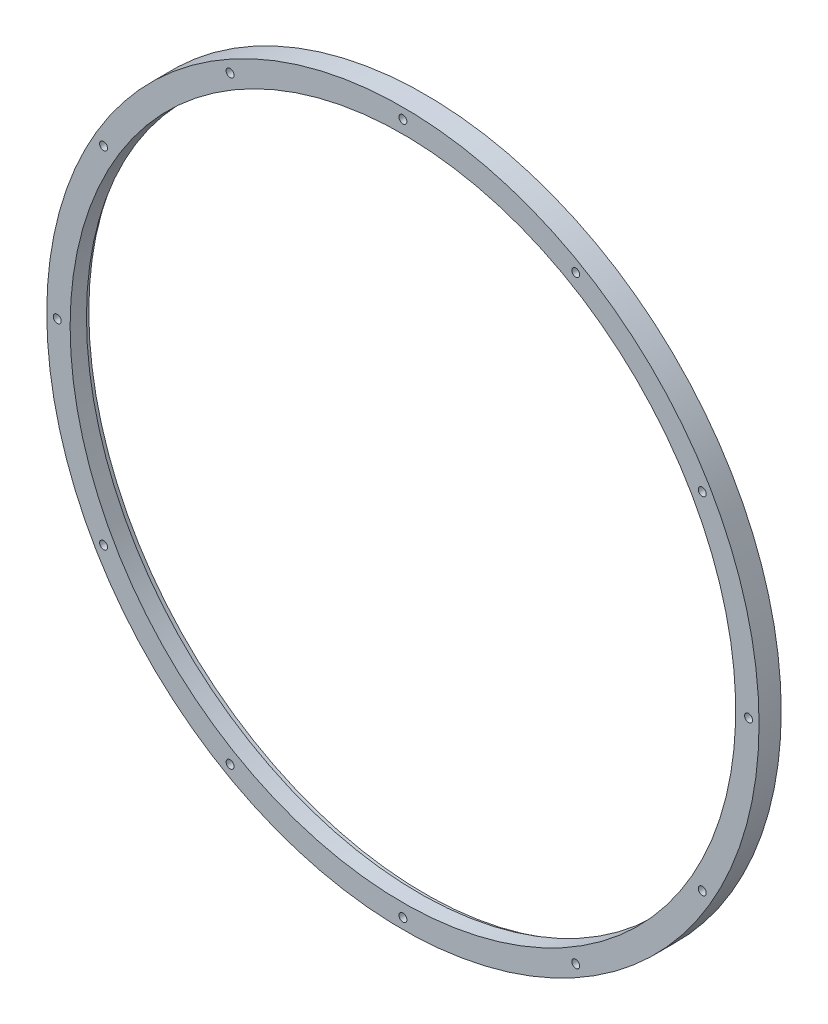
ISO-10303-21;
HEADER;
FILE_DESCRIPTION(('STEP AP214'),'2;1');
FILE_NAME('part.step','',(''),(''),'','','');
FILE_SCHEMA(('AUTOMOTIVE_DESIGN { 1 0 10303 214 1 1 1 1 }'));
ENDSEC;
DATA;
#1=APPLICATION_CONTEXT('core data for automotive mechanical design processes');
#2=APPLICATION_PROTOCOL_DEFINITION('international standard','automotive_design',2000,#1);
#3=PRODUCT_CONTEXT('',#1,'mechanical');
#4=PRODUCT('Part','Part','',(#3));
#5=PRODUCT_RELATED_PRODUCT_CATEGORY('part','',(#4));
#6=PRODUCT_DEFINITION_FORMATION('','',#4);
#7=PRODUCT_DEFINITION_CONTEXT('part definition',#1,'design');
#8=PRODUCT_DEFINITION('design','',#6,#7);
#9=PRODUCT_DEFINITION_SHAPE('','',#8);
#10=(LENGTH_UNIT() NAMED_UNIT(*) SI_UNIT(.MILLI.,.METRE.));
#11=(NAMED_UNIT(*) PLANE_ANGLE_UNIT() SI_UNIT($,.RADIAN.));
#12=(NAMED_UNIT(*) SI_UNIT($,.STERADIAN.) SOLID_ANGLE_UNIT());
#13=UNCERTAINTY_MEASURE_WITH_UNIT(LENGTH_MEASURE(1.E-05),#10,'distance_accuracy_value','');
#14=(GEOMETRIC_REPRESENTATION_CONTEXT(3) GLOBAL_UNCERTAINTY_ASSIGNED_CONTEXT((#13)) GLOBAL_UNIT_ASSIGNED_CONTEXT((#10,
#11,#12)) REPRESENTATION_CONTEXT('',''));
#15=CARTESIAN_POINT('',(0.,0.,0.));
#16=DIRECTION('',(0.,0.,1.));
#17=DIRECTION('',(1.,0.,0.));
#18=AXIS2_PLACEMENT_3D('',#15,#16,#17);
#19=CARTESIAN_POINT('',(256.3435195202,-148.,-2.945));
#20=DIRECTION('',(0.,0.,1.));
#21=DIRECTION('',(-0.866025403784429,0.500000000000017,0.));
#22=AXIS2_PLACEMENT_3D('',#19,#20,#21);
#23=CYLINDRICAL_SURFACE('',#22,3.4);
#24=CARTESIAN_POINT('',(256.3435195202,-148.,0.));
#25=DIRECTION('',(0.,0.,1.));
#26=DIRECTION('',(-0.866025403784454,0.499999999999973,0.));
#27=AXIS2_PLACEMENT_3D('',#24,#25,#26);
#28=CIRCLE('',#27,3.4);
#29=CARTESIAN_POINT('',(259.2880058931,-149.7,0.));
#30=VERTEX_POINT('',#29);
#31=EDGE_CURVE('E184',#30,#30,#28,.T.);
#32=ORIENTED_EDGE('',*,*,#31,.F.);
#33=DIRECTION('',(0.,0.,1.));
#34=VECTOR('',#33,1.);
#35=CARTESIAN_POINT('',(259.288005893067,-149.7,-2.945));
#36=LINE('',#35,#34);
#37=CARTESIAN_POINT('',(259.2880058931,-149.7,19.));
#38=VERTEX_POINT('',#37);
#39=EDGE_CURVE('E11',#30,#38,#36,.T.);
#40=ORIENTED_EDGE('',*,*,#39,.T.);
#41=CARTESIAN_POINT('',(256.3435195202,-148.,19.));
#42=DIRECTION('',(0.,0.,1.));
#43=DIRECTION('',(-0.866025403784454,0.499999999999973,0.));
#44=AXIS2_PLACEMENT_3D('',#41,#42,#43);
#45=CIRCLE('',#44,3.4);
#46=EDGE_CURVE('E285',#38,#38,#45,.T.);
#47=ORIENTED_EDGE('',*,*,#46,.T.);
#48=ORIENTED_EDGE('',*,*,#39,.F.);
#49=EDGE_LOOP('',(#32,#40,#47,#48));
#50=FACE_BOUND('',#49,.T.);
#51=ADVANCED_FACE('F17',(#50),#23,.F.);
#52=CARTESIAN_POINT('',(148.,-256.3435195202,-2.945));
#53=DIRECTION('',(0.,0.,1.));
#54=DIRECTION('',(-0.500000000000017,0.866025403784429,0.));
#55=AXIS2_PLACEMENT_3D('',#52,#53,#54);
#56=CYLINDRICAL_SURFACE('',#55,3.4);
#57=CARTESIAN_POINT('',(148.,-256.3435195202,0.));
#58=DIRECTION('',(0.,0.,1.));
#59=DIRECTION('',(-0.500000000000017,0.866025403784429,0.));
#60=AXIS2_PLACEMENT_3D('',#57,#58,#59);
#61=CIRCLE('',#60,3.4);
#62=CARTESIAN_POINT('',(149.7,-259.2880058931,0.));
#63=VERTEX_POINT('',#62);
#64=EDGE_CURVE('E175',#63,#63,#61,.T.);
#65=ORIENTED_EDGE('',*,*,#64,.F.);
#66=DIRECTION('',(0.,0.,1.));
#67=VECTOR('',#66,1.);
#68=CARTESIAN_POINT('',(149.7,-259.288005893067,-2.945));
#69=LINE('',#68,#67);
#70=CARTESIAN_POINT('',(149.7,-259.2880058931,19.));
#71=VERTEX_POINT('',#70);
#72=EDGE_CURVE('E27',#63,#71,#69,.T.);
#73=ORIENTED_EDGE('',*,*,#72,.T.);
#74=CARTESIAN_POINT('',(148.,-256.3435195202,19.));
#75=DIRECTION('',(0.,0.,1.));
#76=DIRECTION('',(-0.500000000000017,0.866025403784429,0.));
#77=AXIS2_PLACEMENT_3D('',#74,#75,#76);
#78=CIRCLE('',#77,3.4);
#79=EDGE_CURVE('E177',#71,#71,#78,.T.);
#80=ORIENTED_EDGE('',*,*,#79,.T.);
#81=ORIENTED_EDGE('',*,*,#72,.F.);
#82=EDGE_LOOP('',(#65,#73,#80,#81));
#83=FACE_BOUND('',#82,.T.);
#84=ADVANCED_FACE('F174',(#83),#56,.F.);
#85=CARTESIAN_POINT('',(0.,-296.,-2.945));
#86=DIRECTION('',(0.,0.,1.));
#87=DIRECTION('',(0.,1.,0.));
#88=AXIS2_PLACEMENT_3D('',#85,#86,#87);
#89=CYLINDRICAL_SURFACE('',#88,3.4);
#90=CARTESIAN_POINT('',(0.,-296.,0.));
#91=DIRECTION('',(0.,0.,1.));
#92=DIRECTION('',(0.,1.,0.));
#93=AXIS2_PLACEMENT_3D('',#90,#91,#92);
#94=CIRCLE('',#93,3.4);
#95=CARTESIAN_POINT('',(0.,-299.4,0.));
#96=VERTEX_POINT('',#95);
#97=EDGE_CURVE('E185',#96,#96,#94,.T.);
#98=ORIENTED_EDGE('',*,*,#97,.F.);
#99=DIRECTION('',(0.,0.,1.));
#100=VECTOR('',#99,1.);
#101=CARTESIAN_POINT('',(0.,-299.4,-2.945));
#102=LINE('',#101,#100);
#103=CARTESIAN_POINT('',(0.,-299.4,19.));
#104=VERTEX_POINT('',#103);
#105=EDGE_CURVE('E179',#96,#104,#102,.T.);
#106=ORIENTED_EDGE('',*,*,#105,.T.);
#107=CARTESIAN_POINT('',(0.,-296.,19.));
#108=DIRECTION('',(0.,0.,1.));
#109=DIRECTION('',(0.,1.,0.));
#110=AXIS2_PLACEMENT_3D('',#107,#108,#109);
#111=CIRCLE('',#110,3.4);
#112=EDGE_CURVE('E206',#104,#104,#111,.T.);
#113=ORIENTED_EDGE('',*,*,#112,.T.);
#114=ORIENTED_EDGE('',*,*,#105,.F.);
#115=EDGE_LOOP('',(#98,#106,#113,#114));
#116=FACE_BOUND('',#115,.T.);
#117=ADVANCED_FACE('F361',(#116),#89,.F.);
#118=CARTESIAN_POINT('',(-148.,-256.3435195202,-2.945));
#119=DIRECTION('',(0.,0.,1.));
#120=DIRECTION('',(0.500000000000017,0.866025403784429,0.));
#121=AXIS2_PLACEMENT_3D('',#118,#119,#120);
#122=CYLINDRICAL_SURFACE('',#121,3.4);
#123=CARTESIAN_POINT('',(-148.,-256.3435195202,0.));
#124=DIRECTION('',(0.,0.,1.));
#125=DIRECTION('',(0.499999999999973,0.866025403784454,0.));
#126=AXIS2_PLACEMENT_3D('',#123,#124,#125);
#127=CIRCLE('',#126,3.4);
#128=CARTESIAN_POINT('',(-149.7,-259.2880058931,0.));
#129=VERTEX_POINT('',#128);
#130=EDGE_CURVE('E196',#129,#129,#127,.T.);
#131=ORIENTED_EDGE('',*,*,#130,.F.);
#132=DIRECTION('',(0.,0.,1.));
#133=VECTOR('',#132,1.);
#134=CARTESIAN_POINT('',(-149.7,-259.288005893067,-2.945));
#135=LINE('',#134,#133);
#136=CARTESIAN_POINT('',(-149.7,-259.2880058931,19.));
#137=VERTEX_POINT('',#136);
#138=EDGE_CURVE('E257',#129,#137,#135,.T.);
#139=ORIENTED_EDGE('',*,*,#138,.T.);
#140=CARTESIAN_POINT('',(-148.,-256.3435195202,19.));
#141=DIRECTION('',(0.,0.,1.));
#142=DIRECTION('',(0.499999999999973,0.866025403784454,0.));
#143=AXIS2_PLACEMENT_3D('',#140,#141,#142);
#144=CIRCLE('',#143,3.4);
#145=EDGE_CURVE('E202',#137,#137,#144,.T.);
#146=ORIENTED_EDGE('',*,*,#145,.T.);
#147=ORIENTED_EDGE('',*,*,#138,.F.);
#148=EDGE_LOOP('',(#131,#139,#146,#147));
#149=FACE_BOUND('',#148,.T.);
#150=ADVANCED_FACE('F383',(#149),#122,.F.);
#151=CARTESIAN_POINT('',(-256.3435195202,-148.,-2.945));
#152=DIRECTION('',(0.,0.,1.));
#153=DIRECTION('',(0.866025403784429,0.500000000000017,0.));
#154=AXIS2_PLACEMENT_3D('',#151,#152,#153);
#155=CYLINDRICAL_SURFACE('',#154,3.4);
#156=CARTESIAN_POINT('',(-256.3435195202,-148.,0.));
#157=DIRECTION('',(0.,0.,1.));
#158=DIRECTION('',(0.866025403784429,0.500000000000017,0.));
#159=AXIS2_PLACEMENT_3D('',#156,#157,#158);
#160=CIRCLE('',#159,3.4);
#161=CARTESIAN_POINT('',(-259.2880058931,-149.7,0.));
#162=VERTEX_POINT('',#161);
#163=EDGE_CURVE('E267',#162,#162,#160,.T.);
#164=ORIENTED_EDGE('',*,*,#163,.F.);
#165=DIRECTION('',(0.,0.,1.));
#166=VECTOR('',#165,1.);
#167=CARTESIAN_POINT('',(-259.288005893067,-149.7,-2.945));
#168=LINE('',#167,#166);
#169=CARTESIAN_POINT('',(-259.2880058931,-149.7,19.));
#170=VERTEX_POINT('',#169);
#171=EDGE_CURVE('E220',#162,#170,#168,.T.);
#172=ORIENTED_EDGE('',*,*,#171,.T.);
#173=CARTESIAN_POINT('',(-256.3435195202,-148.,19.));
#174=DIRECTION('',(0.,0.,1.));
#175=DIRECTION('',(0.866025403784429,0.500000000000017,0.));
#176=AXIS2_PLACEMENT_3D('',#173,#174,#175);
#177=CIRCLE('',#176,3.4);
#178=EDGE_CURVE('E207',#170,#170,#177,.T.);
#179=ORIENTED_EDGE('',*,*,#178,.T.);
#180=ORIENTED_EDGE('',*,*,#171,.F.);
#181=EDGE_LOOP('',(#164,#172,#179,#180));
#182=FACE_BOUND('',#181,.T.);
#183=ADVANCED_FACE('F380',(#182),#155,.F.);
#184=CARTESIAN_POINT('',(-296.,0.,-2.945));
#185=DIRECTION('',(0.,0.,1.));
#186=DIRECTION('',(1.,0.,0.));
#187=AXIS2_PLACEMENT_3D('',#184,#185,#186);
#188=CYLINDRICAL_SURFACE('',#187,3.4);
#189=CARTESIAN_POINT('',(-296.,0.,0.));
#190=DIRECTION('',(0.,0.,1.));
#191=DIRECTION('',(1.,0.,0.));
#192=AXIS2_PLACEMENT_3D('',#189,#190,#191);
#193=CIRCLE('',#192,3.4);
#194=CARTESIAN_POINT('',(-299.4,0.,0.));
#195=VERTEX_POINT('',#194);
#196=EDGE_CURVE('E200',#195,#195,#193,.T.);
#197=ORIENTED_EDGE('',*,*,#196,.F.);
#198=DIRECTION('',(0.,0.,1.));
#199=VECTOR('',#198,1.);
#200=CARTESIAN_POINT('',(-299.4,0.,-2.945));
#201=LINE('',#200,#199);
#202=CARTESIAN_POINT('',(-299.4,0.,19.));
#203=VERTEX_POINT('',#202);
#204=EDGE_CURVE('E217',#195,#203,#201,.T.);
#205=ORIENTED_EDGE('',*,*,#204,.T.);
#206=CARTESIAN_POINT('',(-296.,0.,19.));
#207=DIRECTION('',(0.,0.,1.));
#208=DIRECTION('',(1.,0.,0.));
#209=AXIS2_PLACEMENT_3D('',#206,#207,#208);
#210=CIRCLE('',#209,3.4);
#211=EDGE_CURVE('E211',#203,#203,#210,.T.);
#212=ORIENTED_EDGE('',*,*,#211,.T.);
#213=ORIENTED_EDGE('',*,*,#204,.F.);
#214=EDGE_LOOP('',(#197,#205,#212,#213));
#215=FACE_BOUND('',#214,.T.);
#216=ADVANCED_FACE('F382',(#215),#188,.F.);
#217=CARTESIAN_POINT('',(-256.3435195202,148.,-2.945));
#218=DIRECTION('',(0.,0.,1.));
#219=DIRECTION('',(0.866025403784429,-0.500000000000017,0.));
#220=AXIS2_PLACEMENT_3D('',#217,#218,#219);
#221=CYLINDRICAL_SURFACE('',#220,3.4);
#222=CARTESIAN_POINT('',(-256.3435195202,148.,0.));
#223=DIRECTION('',(0.,0.,1.));
#224=DIRECTION('',(0.866025403784429,-0.500000000000017,0.));
#225=AXIS2_PLACEMENT_3D('',#222,#223,#224);
#226=CIRCLE('',#225,3.4);
#227=CARTESIAN_POINT('',(-259.2880058931,149.7,0.));
#228=VERTEX_POINT('',#227);
#229=EDGE_CURVE('E317',#228,#228,#226,.T.);
#230=ORIENTED_EDGE('',*,*,#229,.F.);
#231=DIRECTION('',(0.,0.,1.));
#232=VECTOR('',#231,1.);
#233=CARTESIAN_POINT('',(-259.288005893067,149.7,-2.945));
#234=LINE('',#233,#232);
#235=CARTESIAN_POINT('',(-259.2880058931,149.7,19.));
#236=VERTEX_POINT('',#235);
#237=EDGE_CURVE('E21',#228,#236,#234,.T.);
#238=ORIENTED_EDGE('',*,*,#237,.T.);
#239=CARTESIAN_POINT('',(-256.3435195202,148.,19.));
#240=DIRECTION('',(0.,0.,1.));
#241=DIRECTION('',(0.866025403784429,-0.500000000000017,0.));
#242=AXIS2_PLACEMENT_3D('',#239,#240,#241);
#243=CIRCLE('',#242,3.4);
#244=EDGE_CURVE('E212',#236,#236,#243,.T.);
#245=ORIENTED_EDGE('',*,*,#244,.T.);
#246=ORIENTED_EDGE('',*,*,#237,.F.);
#247=EDGE_LOOP('',(#230,#238,#245,#246));
#248=FACE_BOUND('',#247,.T.);
#249=ADVANCED_FACE('F390',(#248),#221,.F.);
#250=CARTESIAN_POINT('',(-148.,256.3435195202,-2.945));
#251=DIRECTION('',(0.,0.,1.));
#252=DIRECTION('',(0.500000000000017,-0.866025403784429,0.));
#253=AXIS2_PLACEMENT_3D('',#250,#251,#252);
#254=CYLINDRICAL_SURFACE('',#253,3.4);
#255=CARTESIAN_POINT('',(-148.,256.3435195202,0.));
#256=DIRECTION('',(0.,0.,1.));
#257=DIRECTION('',(0.500000000000017,-0.866025403784429,0.));
#258=AXIS2_PLACEMENT_3D('',#255,#256,#257);
#259=CIRCLE('',#258,3.4);
#260=CARTESIAN_POINT('',(-149.7,259.2880058931,0.));
#261=VERTEX_POINT('',#260);
#262=EDGE_CURVE('E266',#261,#261,#259,.T.);
#263=ORIENTED_EDGE('',*,*,#262,.F.);
#264=DIRECTION('',(0.,0.,1.));
#265=VECTOR('',#264,1.);
#266=CARTESIAN_POINT('',(-149.7,259.288005893067,-2.945));
#267=LINE('',#266,#265);
#268=CARTESIAN_POINT('',(-149.7,259.2880058931,19.));
#269=VERTEX_POINT('',#268);
#270=EDGE_CURVE('E118',#261,#269,#267,.T.);
#271=ORIENTED_EDGE('',*,*,#270,.T.);
#272=CARTESIAN_POINT('',(-148.,256.3435195202,19.));
#273=DIRECTION('',(0.,0.,1.));
#274=DIRECTION('',(0.500000000000017,-0.866025403784429,0.));
#275=AXIS2_PLACEMENT_3D('',#272,#273,#274);
#276=CIRCLE('',#275,3.4);
#277=EDGE_CURVE('E215',#269,#269,#276,.T.);
#278=ORIENTED_EDGE('',*,*,#277,.T.);
#279=ORIENTED_EDGE('',*,*,#270,.F.);
#280=EDGE_LOOP('',(#263,#271,#278,#279));
#281=FACE_BOUND('',#280,.T.);
#282=ADVANCED_FACE('F372',(#281),#254,.F.);
#283=CARTESIAN_POINT('',(0.,296.,-2.945));
#284=DIRECTION('',(0.,0.,1.));
#285=DIRECTION('',(0.,-1.,0.));
#286=AXIS2_PLACEMENT_3D('',#283,#284,#285);
#287=CYLINDRICAL_SURFACE('',#286,3.4);
#288=CARTESIAN_POINT('',(0.,296.,0.));
#289=DIRECTION('',(0.,0.,1.));
#290=DIRECTION('',(0.,-1.,0.));
#291=AXIS2_PLACEMENT_3D('',#288,#289,#290);
#292=CIRCLE('',#291,3.4);
#293=CARTESIAN_POINT('',(0.,299.4,0.));
#294=VERTEX_POINT('',#293);
#295=EDGE_CURVE('E262',#294,#294,#292,.T.);
#296=ORIENTED_EDGE('',*,*,#295,.F.);
#297=DIRECTION('',(0.,0.,1.));
#298=VECTOR('',#297,1.);
#299=CARTESIAN_POINT('',(0.,299.4,-2.945));
#300=LINE('',#299,#298);
#301=CARTESIAN_POINT('',(0.,299.4,19.));
#302=VERTEX_POINT('',#301);
#303=EDGE_CURVE('E126',#294,#302,#300,.T.);
#304=ORIENTED_EDGE('',*,*,#303,.T.);
#305=CARTESIAN_POINT('',(0.,296.,19.));
#306=DIRECTION('',(0.,0.,1.));
#307=DIRECTION('',(0.,-1.,0.));
#308=AXIS2_PLACEMENT_3D('',#305,#306,#307);
#309=CIRCLE('',#308,3.4);
#310=EDGE_CURVE('E235',#302,#302,#309,.T.);
#311=ORIENTED_EDGE('',*,*,#310,.T.);
#312=ORIENTED_EDGE('',*,*,#303,.F.);
#313=EDGE_LOOP('',(#296,#304,#311,#312));
#314=FACE_BOUND('',#313,.T.);
#315=ADVANCED_FACE('F368',(#314),#287,.F.);
#316=CARTESIAN_POINT('',(148.,256.3435195202,-2.945));
#317=DIRECTION('',(0.,0.,1.));
#318=DIRECTION('',(-0.500000000000017,-0.866025403784429,0.));
#319=AXIS2_PLACEMENT_3D('',#316,#317,#318);
#320=CYLINDRICAL_SURFACE('',#319,3.4);
#321=CARTESIAN_POINT('',(148.,256.3435195202,0.));
#322=DIRECTION('',(0.,0.,1.));
#323=DIRECTION('',(-0.500000000000017,-0.866025403784429,0.));
#324=AXIS2_PLACEMENT_3D('',#321,#322,#323);
#325=CIRCLE('',#324,3.4);
#326=CARTESIAN_POINT('',(149.7,259.2880058931,0.));
#327=VERTEX_POINT('',#326);
#328=EDGE_CURVE('E229',#327,#327,#325,.T.);
#329=ORIENTED_EDGE('',*,*,#328,.F.);
#330=DIRECTION('',(0.,0.,1.));
#331=VECTOR('',#330,1.);
#332=CARTESIAN_POINT('',(149.7,259.288005893067,-2.945));
#333=LINE('',#332,#331);
#334=CARTESIAN_POINT('',(149.7,259.2880058931,19.));
#335=VERTEX_POINT('',#334);
#336=EDGE_CURVE('E244',#327,#335,#333,.T.);
#337=ORIENTED_EDGE('',*,*,#336,.T.);
#338=CARTESIAN_POINT('',(148.,256.3435195202,19.));
#339=DIRECTION('',(0.,0.,1.));
#340=DIRECTION('',(-0.500000000000017,-0.866025403784429,0.));
#341=AXIS2_PLACEMENT_3D('',#338,#339,#340);
#342=CIRCLE('',#341,3.4);
#343=EDGE_CURVE('E231',#335,#335,#342,.T.);
#344=ORIENTED_EDGE('',*,*,#343,.T.);
#345=ORIENTED_EDGE('',*,*,#336,.F.);
#346=EDGE_LOOP('',(#329,#337,#344,#345));
#347=FACE_BOUND('',#346,.T.);
#348=ADVANCED_FACE('F371',(#347),#320,.F.);
#349=CARTESIAN_POINT('',(256.3435195202,148.,-2.945));
#350=DIRECTION('',(0.,0.,1.));
#351=DIRECTION('',(-0.866025403784429,-0.500000000000017,0.));
#352=AXIS2_PLACEMENT_3D('',#349,#350,#351);
#353=CYLINDRICAL_SURFACE('',#352,3.4);
#354=CARTESIAN_POINT('',(256.3435195202,148.,0.));
#355=DIRECTION('',(0.,0.,1.));
#356=DIRECTION('',(-0.866025403784429,-0.500000000000017,0.));
#357=AXIS2_PLACEMENT_3D('',#354,#355,#356);
#358=CIRCLE('',#357,3.4);
#359=CARTESIAN_POINT('',(259.2880058931,149.7,0.));
#360=VERTEX_POINT('',#359);
#361=EDGE_CURVE('E225',#360,#360,#358,.T.);
#362=ORIENTED_EDGE('',*,*,#361,.F.);
#363=DIRECTION('',(0.,0.,1.));
#364=VECTOR('',#363,1.);
#365=CARTESIAN_POINT('',(259.288005893067,149.7,-2.945));
#366=LINE('',#365,#364);
#367=CARTESIAN_POINT('',(259.2880058931,149.7,19.));
#368=VERTEX_POINT('',#367);
#369=EDGE_CURVE('E275',#360,#368,#366,.T.);
#370=ORIENTED_EDGE('',*,*,#369,.T.);
#371=CARTESIAN_POINT('',(256.3435195202,148.,19.));
#372=DIRECTION('',(0.,0.,1.));
#373=DIRECTION('',(-0.866025403784429,-0.500000000000017,0.));
#374=AXIS2_PLACEMENT_3D('',#371,#372,#373);
#375=CIRCLE('',#374,3.4);
#376=EDGE_CURVE('E236',#368,#368,#375,.T.);
#377=ORIENTED_EDGE('',*,*,#376,.T.);
#378=ORIENTED_EDGE('',*,*,#369,.F.);
#379=EDGE_LOOP('',(#362,#370,#377,#378));
#380=FACE_BOUND('',#379,.T.);
#381=ADVANCED_FACE('F332',(#380),#353,.F.);
#382=CARTESIAN_POINT('',(296.,0.,-2.945));
#383=DIRECTION('',(0.,0.,1.));
#384=DIRECTION('',(-1.,0.,0.));
#385=AXIS2_PLACEMENT_3D('',#382,#383,#384);
#386=CYLINDRICAL_SURFACE('',#385,3.4);
#387=CARTESIAN_POINT('',(296.,0.,0.));
#388=DIRECTION('',(0.,0.,1.));
#389=DIRECTION('',(-1.,0.,0.));
#390=AXIS2_PLACEMENT_3D('',#387,#388,#389);
#391=CIRCLE('',#390,3.4);
#392=CARTESIAN_POINT('',(299.4,0.,0.));
#393=VERTEX_POINT('',#392);
#394=EDGE_CURVE('E230',#393,#393,#391,.T.);
#395=ORIENTED_EDGE('',*,*,#394,.F.);
#396=DIRECTION('',(0.,0.,1.));
#397=VECTOR('',#396,1.);
#398=CARTESIAN_POINT('',(299.4,0.,-2.945));
#399=LINE('',#398,#397);
#400=CARTESIAN_POINT('',(299.4,0.,19.));
#401=VERTEX_POINT('',#400);
#402=EDGE_CURVE('E271',#393,#401,#399,.T.);
#403=ORIENTED_EDGE('',*,*,#402,.T.);
#404=CARTESIAN_POINT('',(296.,0.,19.));
#405=DIRECTION('',(0.,0.,1.));
#406=DIRECTION('',(-1.,0.,0.));
#407=AXIS2_PLACEMENT_3D('',#404,#405,#406);
#408=CIRCLE('',#407,3.4);
#409=EDGE_CURVE('E250',#401,#401,#408,.T.);
#410=ORIENTED_EDGE('',*,*,#409,.T.);
#411=ORIENTED_EDGE('',*,*,#402,.F.);
#412=EDGE_LOOP('',(#395,#403,#410,#411));
#413=FACE_BOUND('',#412,.T.);
#414=ADVANCED_FACE('F379',(#413),#386,.F.);
#415=CARTESIAN_POINT('',(0.,0.,0.));
#416=DIRECTION('',(0.,0.,-1.));
#417=DIRECTION('',(1.,0.,0.));
#418=AXIS2_PLACEMENT_3D('',#415,#416,#417);
#419=CYLINDRICAL_SURFACE('',#418,288.);
#420=CARTESIAN_POINT('',(0.,0.,5.));
#421=DIRECTION('',(0.,0.,-1.));
#422=DIRECTION('',(1.,0.,0.));
#423=AXIS2_PLACEMENT_3D('',#420,#421,#422);
#424=CIRCLE('',#423,288.);
#425=CARTESIAN_POINT('',(-288.,0.,5.));
#426=VERTEX_POINT('',#425);
#427=EDGE_CURVE('E223',#426,#426,#424,.T.);
#428=ORIENTED_EDGE('',*,*,#427,.F.);
#429=DIRECTION('',(0.,0.,-1.));
#430=VECTOR('',#429,1.);
#431=CARTESIAN_POINT('',(-288.,0.,0.));
#432=LINE('',#431,#430);
#433=CARTESIAN_POINT('',(-288.,0.,0.));
#434=VERTEX_POINT('',#433);
#435=EDGE_CURVE('E40',#426,#434,#432,.T.);
#436=ORIENTED_EDGE('',*,*,#435,.T.);
#437=CARTESIAN_POINT('',(0.,0.,0.));
#438=DIRECTION('',(0.,0.,-1.));
#439=DIRECTION('',(1.,0.,0.));
#440=AXIS2_PLACEMENT_3D('',#437,#438,#439);
#441=CIRCLE('',#440,288.);
#442=EDGE_CURVE('E297',#434,#434,#441,.T.);
#443=ORIENTED_EDGE('',*,*,#442,.T.);
#444=ORIENTED_EDGE('',*,*,#435,.F.);
#445=EDGE_LOOP('',(#428,#436,#443,#444));
#446=FACE_BOUND('',#445,.T.);
#447=ADVANCED_FACE('F374',(#446),#419,.F.);
#448=CARTESIAN_POINT('',(0.,0.,5.));
#449=DIRECTION('',(0.,0.,-1.));
#450=DIRECTION('',(0.,-1.,0.));
#451=AXIS2_PLACEMENT_3D('',#448,#449,#450);
#452=PLANE('',#451);
#453=CARTESIAN_POINT('',(0.,0.,5.));
#454=DIRECTION('',(0.,0.,1.));
#455=DIRECTION('',(-1.,0.,0.));
#456=AXIS2_PLACEMENT_3D('',#453,#454,#455);
#457=CIRCLE('',#456,285.);
#458=CARTESIAN_POINT('',(-285.,0.,5.));
#459=VERTEX_POINT('',#458);
#460=EDGE_CURVE('E224',#459,#459,#457,.T.);
#461=ORIENTED_EDGE('',*,*,#460,.T.);
#462=EDGE_LOOP('',(#461));
#463=FACE_BOUND('',#462,.T.);
#464=ORIENTED_EDGE('',*,*,#427,.T.);
#465=EDGE_LOOP('',(#464));
#466=FACE_BOUND('',#465,.T.);
#467=ADVANCED_FACE('F367',(#463,#466),#452,.T.);
#468=CARTESIAN_POINT('',(0.,0.,0.));
#469=DIRECTION('',(0.,0.,1.));
#470=DIRECTION('',(1.,0.,0.));
#471=AXIS2_PLACEMENT_3D('',#468,#469,#470);
#472=CYLINDRICAL_SURFACE('',#471,285.);
#473=ORIENTED_EDGE('',*,*,#460,.F.);
#474=DIRECTION('',(0.,0.,1.));
#475=VECTOR('',#474,1.);
#476=CARTESIAN_POINT('',(-285.,0.,0.));
#477=LINE('',#476,#475);
#478=CARTESIAN_POINT('',(-285.,0.,19.));
#479=VERTEX_POINT('',#478);
#480=EDGE_CURVE('E53',#459,#479,#477,.T.);
#481=ORIENTED_EDGE('',*,*,#480,.T.);
#482=CARTESIAN_POINT('',(0.,0.,19.));
#483=DIRECTION('',(0.,0.,-1.));
#484=DIRECTION('',(1.,0.,0.));
#485=AXIS2_PLACEMENT_3D('',#482,#483,#484);
#486=CIRCLE('',#485,285.);
#487=EDGE_CURVE('E246',#479,#479,#486,.T.);
#488=ORIENTED_EDGE('',*,*,#487,.F.);
#489=ORIENTED_EDGE('',*,*,#480,.F.);
#490=EDGE_LOOP('',(#473,#481,#488,#489));
#491=FACE_BOUND('',#490,.T.);
#492=ADVANCED_FACE('F338',(#491),#472,.F.);
#493=CARTESIAN_POINT('',(0.,0.,19.));
#494=DIRECTION('',(0.,0.,1.));
#495=DIRECTION('',(1.,0.,0.));
#496=AXIS2_PLACEMENT_3D('',#493,#494,#495);
#497=PLANE('',#496);
#498=ORIENTED_EDGE('',*,*,#46,.F.);
#499=EDGE_LOOP('',(#498));
#500=FACE_BOUND('',#499,.T.);
#501=ORIENTED_EDGE('',*,*,#79,.F.);
#502=EDGE_LOOP('',(#501));
#503=FACE_BOUND('',#502,.T.);
#504=ORIENTED_EDGE('',*,*,#112,.F.);
#505=EDGE_LOOP('',(#504));
#506=FACE_BOUND('',#505,.T.);
#507=ORIENTED_EDGE('',*,*,#145,.F.);
#508=EDGE_LOOP('',(#507));
#509=FACE_BOUND('',#508,.T.);
#510=ORIENTED_EDGE('',*,*,#178,.F.);
#511=EDGE_LOOP('',(#510));
#512=FACE_BOUND('',#511,.T.);
#513=ORIENTED_EDGE('',*,*,#211,.F.);
#514=EDGE_LOOP('',(#513));
#515=FACE_BOUND('',#514,.T.);
#516=ORIENTED_EDGE('',*,*,#244,.F.);
#517=EDGE_LOOP('',(#516));
#518=FACE_BOUND('',#517,.T.);
#519=ORIENTED_EDGE('',*,*,#277,.F.);
#520=EDGE_LOOP('',(#519));
#521=FACE_BOUND('',#520,.T.);
#522=ORIENTED_EDGE('',*,*,#310,.F.);
#523=EDGE_LOOP('',(#522));
#524=FACE_BOUND('',#523,.T.);
#525=ORIENTED_EDGE('',*,*,#343,.F.);
#526=EDGE_LOOP('',(#525));
#527=FACE_BOUND('',#526,.T.);
#528=ORIENTED_EDGE('',*,*,#376,.F.);
#529=EDGE_LOOP('',(#528));
#530=FACE_BOUND('',#529,.T.);
#531=ORIENTED_EDGE('',*,*,#409,.F.);
#532=EDGE_LOOP('',(#531));
#533=FACE_BOUND('',#532,.T.);
#534=ORIENTED_EDGE('',*,*,#487,.T.);
#535=EDGE_LOOP('',(#534));
#536=FACE_BOUND('',#535,.T.);
#537=CARTESIAN_POINT('',(0.,0.,19.));
#538=DIRECTION('',(0.,0.,1.));
#539=DIRECTION('',(1.,0.,0.));
#540=AXIS2_PLACEMENT_3D('',#537,#538,#539);
#541=CIRCLE('',#540,305.);
#542=CARTESIAN_POINT('',(-305.,0.,19.));
#543=VERTEX_POINT('',#542);
#544=EDGE_CURVE('E193',#543,#543,#541,.T.);
#545=ORIENTED_EDGE('',*,*,#544,.T.);
#546=EDGE_LOOP('',(#545));
#547=FACE_BOUND('',#546,.T.);
#548=ADVANCED_FACE('F334',(#500,#503,#506,#509,#512,#515,#518,#521,#524,#527,#530,#533,#536,
#547),#497,.T.);
#549=CARTESIAN_POINT('',(0.,0.,0.));
#550=DIRECTION('',(0.,0.,1.));
#551=DIRECTION('',(1.,0.,0.));
#552=AXIS2_PLACEMENT_3D('',#549,#550,#551);
#553=CYLINDRICAL_SURFACE('',#552,305.);
#554=ORIENTED_EDGE('',*,*,#544,.F.);
#555=DIRECTION('',(0.,0.,-1.));
#556=VECTOR('',#555,1.);
#557=CARTESIAN_POINT('',(-305.,0.,0.));
#558=LINE('',#557,#556);
#559=CARTESIAN_POINT('',(-305.,0.,0.));
#560=VERTEX_POINT('',#559);
#561=EDGE_CURVE('E251',#543,#560,#558,.T.);
#562=ORIENTED_EDGE('',*,*,#561,.T.);
#563=CARTESIAN_POINT('',(0.,0.,0.));
#564=DIRECTION('',(0.,0.,1.));
#565=DIRECTION('',(1.,0.,0.));
#566=AXIS2_PLACEMENT_3D('',#563,#564,#565);
#567=CIRCLE('',#566,305.);
#568=EDGE_CURVE('E293',#560,#560,#567,.T.);
#569=ORIENTED_EDGE('',*,*,#568,.T.);
#570=ORIENTED_EDGE('',*,*,#561,.F.);
#571=EDGE_LOOP('',(#554,#562,#569,#570));
#572=FACE_BOUND('',#571,.T.);
#573=ADVANCED_FACE('F337',(#572),#553,.T.);
#574=CARTESIAN_POINT('',(0.,0.,0.));
#575=DIRECTION('',(0.,0.,1.));
#576=DIRECTION('',(1.,0.,0.));
#577=AXIS2_PLACEMENT_3D('',#574,#575,#576);
#578=PLANE('',#577);
#579=ORIENTED_EDGE('',*,*,#31,.T.);
#580=EDGE_LOOP('',(#579));
#581=FACE_BOUND('',#580,.T.);
#582=ORIENTED_EDGE('',*,*,#64,.T.);
#583=EDGE_LOOP('',(#582));
#584=FACE_BOUND('',#583,.T.);
#585=ORIENTED_EDGE('',*,*,#97,.T.);
#586=EDGE_LOOP('',(#585));
#587=FACE_BOUND('',#586,.T.);
#588=ORIENTED_EDGE('',*,*,#130,.T.);
#589=EDGE_LOOP('',(#588));
#590=FACE_BOUND('',#589,.T.);
#591=ORIENTED_EDGE('',*,*,#163,.T.);
#592=EDGE_LOOP('',(#591));
#593=FACE_BOUND('',#592,.T.);
#594=ORIENTED_EDGE('',*,*,#196,.T.);
#595=EDGE_LOOP('',(#594));
#596=FACE_BOUND('',#595,.T.);
#597=ORIENTED_EDGE('',*,*,#229,.T.);
#598=EDGE_LOOP('',(#597));
#599=FACE_BOUND('',#598,.T.);
#600=ORIENTED_EDGE('',*,*,#262,.T.);
#601=EDGE_LOOP('',(#600));
#602=FACE_BOUND('',#601,.T.);
#603=ORIENTED_EDGE('',*,*,#295,.T.);
#604=EDGE_LOOP('',(#603));
#605=FACE_BOUND('',#604,.T.);
#606=ORIENTED_EDGE('',*,*,#328,.T.);
#607=EDGE_LOOP('',(#606));
#608=FACE_BOUND('',#607,.T.);
#609=ORIENTED_EDGE('',*,*,#361,.T.);
#610=EDGE_LOOP('',(#609));
#611=FACE_BOUND('',#610,.T.);
#612=ORIENTED_EDGE('',*,*,#394,.T.);
#613=EDGE_LOOP('',(#612));
#614=FACE_BOUND('',#613,.T.);
#615=ORIENTED_EDGE('',*,*,#442,.F.);
#616=EDGE_LOOP('',(#615));
#617=FACE_BOUND('',#616,.T.);
#618=ORIENTED_EDGE('',*,*,#568,.F.);
#619=EDGE_LOOP('',(#618));
#620=FACE_BOUND('',#619,.T.);
#621=ADVANCED_FACE('F19',(#581,#584,#587,#590,#593,#596,#599,#602,#605,#608,#611,#614,#617,
#620),#578,.F.);
#622=CLOSED_SHELL('',(#51,#84,#117,#150,#183,#216,#249,#282,#315,#348,#381,#414,#447,#467,#492,
#548,#573,#621));
#623=MANIFOLD_SOLID_BREP('B1',#622);
#624=ADVANCED_BREP_SHAPE_REPRESENTATION('',(#18,#623),#14);
#625=SHAPE_DEFINITION_REPRESENTATION(#9,#624);
ENDSEC;
END-ISO-10303-21;
